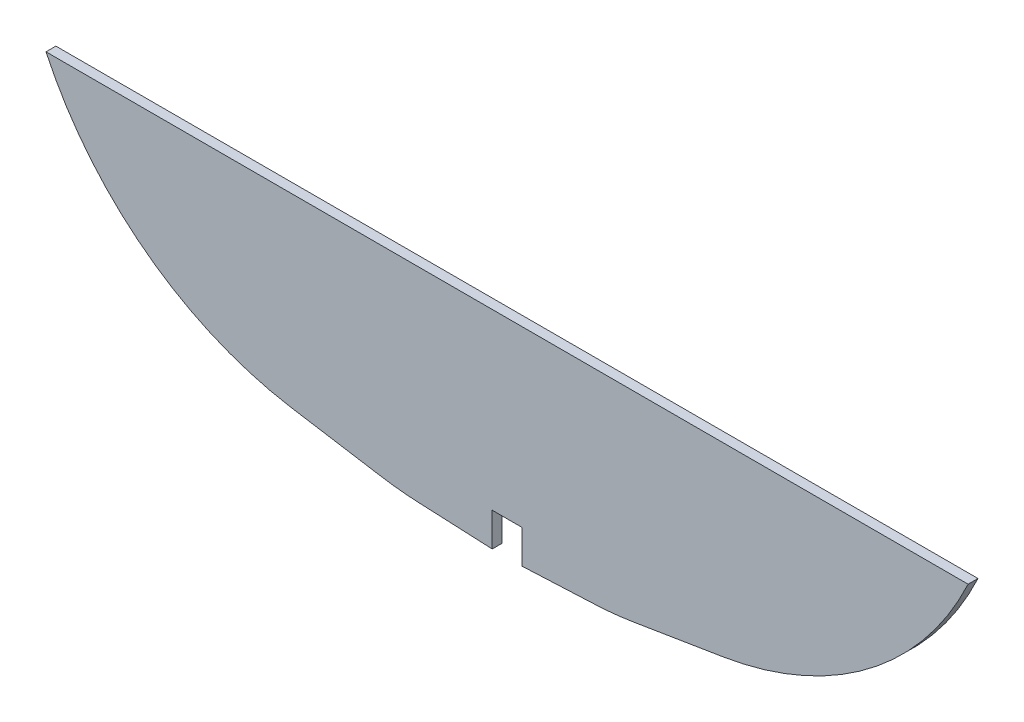
ISO-10303-21;
HEADER;
FILE_DESCRIPTION(('STEP AP214'),'2;1');
FILE_NAME('part.step','',(''),(''),'','','');
FILE_SCHEMA(('AUTOMOTIVE_DESIGN { 1 0 10303 214 1 1 1 1 }'));
ENDSEC;
DATA;
#1=APPLICATION_CONTEXT('core data for automotive mechanical design processes');
#2=APPLICATION_PROTOCOL_DEFINITION('international standard','automotive_design',2000,#1);
#3=PRODUCT_CONTEXT('',#1,'mechanical');
#4=PRODUCT('Part','Part','',(#3));
#5=PRODUCT_RELATED_PRODUCT_CATEGORY('part','',(#4));
#6=PRODUCT_DEFINITION_FORMATION('','',#4);
#7=PRODUCT_DEFINITION_CONTEXT('part definition',#1,'design');
#8=PRODUCT_DEFINITION('design','',#6,#7);
#9=PRODUCT_DEFINITION_SHAPE('','',#8);
#10=(LENGTH_UNIT() NAMED_UNIT(*) SI_UNIT(.MILLI.,.METRE.));
#11=(NAMED_UNIT(*) PLANE_ANGLE_UNIT() SI_UNIT($,.RADIAN.));
#12=(NAMED_UNIT(*) SI_UNIT($,.STERADIAN.) SOLID_ANGLE_UNIT());
#13=UNCERTAINTY_MEASURE_WITH_UNIT(LENGTH_MEASURE(1.E-05),#10,'distance_accuracy_value','');
#14=(GEOMETRIC_REPRESENTATION_CONTEXT(3) GLOBAL_UNCERTAINTY_ASSIGNED_CONTEXT((#13)) GLOBAL_UNIT_ASSIGNED_CONTEXT((#10,
#11,#12)) REPRESENTATION_CONTEXT('',''));
#15=CARTESIAN_POINT('',(0.,0.,0.));
#16=DIRECTION('',(0.,0.,1.));
#17=DIRECTION('',(1.,0.,0.));
#18=AXIS2_PLACEMENT_3D('',#15,#16,#17);
#19=CARTESIAN_POINT('',(3.43117854329258,-26.2574153577138,3.));
#20=DIRECTION('',(0.160874005706943,0.986974951195724,0.));
#21=DIRECTION('',(-0.986974951195724,0.160874005706943,0.));
#22=AXIS2_PLACEMENT_3D('',#19,#20,#21);
#23=PLANE('',#22);
#24=DIRECTION('',(0.986974951195724,-0.160874005706943,0.));
#25=VECTOR('',#24,1.);
#26=CARTESIAN_POINT('',(3.43117854329258,-26.2574153577138,0.));
#27=LINE('',#26,#25);
#28=CARTESIAN_POINT('',(-29.4279438011297,-20.9014753420553,0.));
#29=VERTEX_POINT('',#28);
#30=CARTESIAN_POINT('',(-2.25172300963461,-25.331119167775,0.));
#31=VERTEX_POINT('',#30);
#32=EDGE_CURVE('E162',#29,#31,#27,.T.);
#33=ORIENTED_EDGE('',*,*,#32,.T.);
#34=DIRECTION('',(0.,0.,-1.));
#35=VECTOR('',#34,1.);
#36=CARTESIAN_POINT('',(-2.25172300963461,-25.331119167775,3.));
#37=LINE('',#36,#35);
#38=CARTESIAN_POINT('',(-2.25172300963461,-25.331119167775,3.));
#39=VERTEX_POINT('',#38);
#40=EDGE_CURVE('E11',#31,#39,#37,.F.);
#41=ORIENTED_EDGE('',*,*,#40,.T.);
#42=DIRECTION('',(0.986974951195724,-0.160874005706943,0.));
#43=VECTOR('',#42,1.);
#44=CARTESIAN_POINT('',(3.43117854329258,-26.2574153577138,3.));
#45=LINE('',#44,#43);
#46=CARTESIAN_POINT('',(-29.4279438011297,-20.9014753420553,3.));
#47=VERTEX_POINT('',#46);
#48=EDGE_CURVE('E133',#47,#39,#45,.T.);
#49=ORIENTED_EDGE('',*,*,#48,.F.);
#50=DIRECTION('',(0.,0.,-1.));
#51=VECTOR('',#50,1.);
#52=CARTESIAN_POINT('',(-29.4279438011297,-20.9014753420553,3.));
#53=LINE('',#52,#51);
#54=EDGE_CURVE('E43',#47,#29,#53,.T.);
#55=ORIENTED_EDGE('',*,*,#54,.T.);
#56=EDGE_LOOP('',(#33,#41,#49,#55));
#57=FACE_BOUND('',#56,.T.);
#58=ADVANCED_FACE('F35',(#57),#23,.F.);
#59=CARTESIAN_POINT('',(31.5765866519712,-27.568395021453,3.));
#60=DIRECTION('',(0.0465283653815297,0.998916969129528,0.));
#61=DIRECTION('',(-0.998916969129528,0.0465283653815297,0.));
#62=AXIS2_PLACEMENT_3D('',#59,#60,#61);
#63=PLANE('',#62);
#64=DIRECTION('',(0.998916969129528,-0.0465283653815297,0.));
#65=VECTOR('',#64,1.);
#66=CARTESIAN_POINT('',(31.5765866519712,-27.568395021453,3.));
#67=LINE('',#66,#65);
#68=CARTESIAN_POINT('',(9.18284102290671,-26.5253209611554,3.));
#69=VERTEX_POINT('',#68);
#70=CARTESIAN_POINT('',(31.5765866519712,-27.568395021453,3.));
#71=VERTEX_POINT('',#70);
#72=EDGE_CURVE('E123',#69,#71,#67,.T.);
#73=ORIENTED_EDGE('',*,*,#72,.F.);
#74=DIRECTION('',(0.,0.,-1.));
#75=VECTOR('',#74,1.);
#76=CARTESIAN_POINT('',(9.18284102290671,-26.5253209611554,3.));
#77=LINE('',#76,#75);
#78=CARTESIAN_POINT('',(9.18284102290671,-26.5253209611554,0.));
#79=VERTEX_POINT('',#78);
#80=EDGE_CURVE('E212',#69,#79,#77,.T.);
#81=ORIENTED_EDGE('',*,*,#80,.T.);
#82=DIRECTION('',(0.998916969129528,-0.0465283653815297,0.));
#83=VECTOR('',#82,1.);
#84=CARTESIAN_POINT('',(31.5765866519712,-27.568395021453,0.));
#85=LINE('',#84,#83);
#86=CARTESIAN_POINT('',(31.5765866519712,-27.568395021453,0.));
#87=VERTEX_POINT('',#86);
#88=EDGE_CURVE('E139',#79,#87,#85,.T.);
#89=ORIENTED_EDGE('',*,*,#88,.T.);
#90=DIRECTION('',(0.,0.,-1.));
#91=VECTOR('',#90,1.);
#92=CARTESIAN_POINT('',(31.5765866519712,-27.568395021453,3.));
#93=LINE('',#92,#91);
#94=EDGE_CURVE('E136',#71,#87,#93,.T.);
#95=ORIENTED_EDGE('',*,*,#94,.F.);
#96=EDGE_LOOP('',(#73,#81,#89,#95));
#97=FACE_BOUND('',#96,.T.);
#98=ADVANCED_FACE('F137',(#97),#63,.F.);
#99=CARTESIAN_POINT('',(31.5765866519712,-27.568395021453,3.));
#100=DIRECTION('',(-1.,0.,0.));
#101=DIRECTION('',(0.,-1.,0.));
#102=AXIS2_PLACEMENT_3D('',#99,#100,#101);
#103=PLANE('',#102);
#104=DIRECTION('',(0.,1.,0.));
#105=VECTOR('',#104,1.);
#106=CARTESIAN_POINT('',(31.5765866519712,-27.568395021453,0.));
#107=LINE('',#106,#105);
#108=CARTESIAN_POINT('',(31.5765866519712,-17.368395021453,0.));
#109=VERTEX_POINT('',#108);
#110=EDGE_CURVE('E166',#87,#109,#107,.T.);
#111=ORIENTED_EDGE('',*,*,#110,.T.);
#112=DIRECTION('',(0.,0.,-1.));
#113=VECTOR('',#112,1.);
#114=CARTESIAN_POINT('',(31.5765866519712,-17.368395021453,3.));
#115=LINE('',#114,#113);
#116=CARTESIAN_POINT('',(31.5765866519712,-17.368395021453,3.));
#117=VERTEX_POINT('',#116);
#118=EDGE_CURVE('E143',#117,#109,#115,.T.);
#119=ORIENTED_EDGE('',*,*,#118,.F.);
#120=DIRECTION('',(0.,1.,0.));
#121=VECTOR('',#120,1.);
#122=CARTESIAN_POINT('',(31.5765866519712,-27.568395021453,3.));
#123=LINE('',#122,#121);
#124=EDGE_CURVE('E128',#71,#117,#123,.T.);
#125=ORIENTED_EDGE('',*,*,#124,.F.);
#126=ORIENTED_EDGE('',*,*,#94,.T.);
#127=EDGE_LOOP('',(#111,#119,#125,#126));
#128=FACE_BOUND('',#127,.T.);
#129=ADVANCED_FACE('F145',(#128),#103,.F.);
#130=CARTESIAN_POINT('',(31.5765866519712,-17.368395021453,3.));
#131=DIRECTION('',(0.,1.,0.));
#132=DIRECTION('',(0.,0.,1.));
#133=AXIS2_PLACEMENT_3D('',#130,#131,#132);
#134=PLANE('',#133);
#135=DIRECTION('',(1.,0.,0.));
#136=VECTOR('',#135,1.);
#137=CARTESIAN_POINT('',(31.5765866519712,-17.368395021453,0.));
#138=LINE('',#137,#136);
#139=CARTESIAN_POINT('',(40.5765866519712,-17.368395021453,0.));
#140=VERTEX_POINT('',#139);
#141=EDGE_CURVE('E168',#109,#140,#138,.T.);
#142=ORIENTED_EDGE('',*,*,#141,.T.);
#143=DIRECTION('',(0.,0.,-1.));
#144=VECTOR('',#143,1.);
#145=CARTESIAN_POINT('',(40.5765866519712,-17.368395021453,3.));
#146=LINE('',#145,#144);
#147=CARTESIAN_POINT('',(40.5765866519712,-17.368395021453,3.));
#148=VERTEX_POINT('',#147);
#149=EDGE_CURVE('E188',#148,#140,#146,.T.);
#150=ORIENTED_EDGE('',*,*,#149,.F.);
#151=DIRECTION('',(1.,0.,0.));
#152=VECTOR('',#151,1.);
#153=CARTESIAN_POINT('',(31.5765866519712,-17.368395021453,3.));
#154=LINE('',#153,#152);
#155=EDGE_CURVE('E148',#117,#148,#154,.T.);
#156=ORIENTED_EDGE('',*,*,#155,.F.);
#157=ORIENTED_EDGE('',*,*,#118,.T.);
#158=EDGE_LOOP('',(#142,#150,#156,#157));
#159=FACE_BOUND('',#158,.T.);
#160=ADVANCED_FACE('F253',(#159),#134,.F.);
#161=CARTESIAN_POINT('',(40.5765866519712,-27.568395021453,3.));
#162=DIRECTION('',(1.,0.,0.));
#163=DIRECTION('',(0.,1.,0.));
#164=AXIS2_PLACEMENT_3D('',#161,#162,#163);
#165=PLANE('',#164);
#166=DIRECTION('',(0.,-1.,0.));
#167=VECTOR('',#166,1.);
#168=CARTESIAN_POINT('',(40.5765866519712,-27.568395021453,0.));
#169=LINE('',#168,#167);
#170=CARTESIAN_POINT('',(40.5765866519712,-27.568395021453,0.));
#171=VERTEX_POINT('',#170);
#172=EDGE_CURVE('E170',#140,#171,#169,.T.);
#173=ORIENTED_EDGE('',*,*,#172,.T.);
#174=DIRECTION('',(0.,0.,-1.));
#175=VECTOR('',#174,1.);
#176=CARTESIAN_POINT('',(40.5765866519712,-27.568395021453,3.));
#177=LINE('',#176,#175);
#178=CARTESIAN_POINT('',(40.5765866519712,-27.568395021453,3.));
#179=VERTEX_POINT('',#178);
#180=EDGE_CURVE('E185',#179,#171,#177,.T.);
#181=ORIENTED_EDGE('',*,*,#180,.F.);
#182=DIRECTION('',(0.,-1.,0.));
#183=VECTOR('',#182,1.);
#184=CARTESIAN_POINT('',(40.5765866519712,-27.568395021453,3.));
#185=LINE('',#184,#183);
#186=EDGE_CURVE('E150',#148,#179,#185,.T.);
#187=ORIENTED_EDGE('',*,*,#186,.F.);
#188=ORIENTED_EDGE('',*,*,#149,.T.);
#189=EDGE_LOOP('',(#173,#181,#187,#188));
#190=FACE_BOUND('',#189,.T.);
#191=ADVANCED_FACE('F249',(#190),#165,.F.);
#192=CARTESIAN_POINT('',(40.5765866519712,-27.568395021453,3.));
#193=DIRECTION('',(-0.0465283653815297,0.998916969129528,0.));
#194=DIRECTION('',(-0.998916969129528,-0.0465283653815297,0.));
#195=AXIS2_PLACEMENT_3D('',#192,#193,#194);
#196=PLANE('',#195);
#197=DIRECTION('',(0.998916969129528,0.0465283653815297,0.));
#198=VECTOR('',#197,1.);
#199=CARTESIAN_POINT('',(40.5765866519712,-27.568395021453,0.));
#200=LINE('',#199,#198);
#201=CARTESIAN_POINT('',(62.9703322810358,-26.5253209611554,0.));
#202=VERTEX_POINT('',#201);
#203=EDGE_CURVE('E172',#171,#202,#200,.T.);
#204=ORIENTED_EDGE('',*,*,#203,.T.);
#205=DIRECTION('',(0.,0.,-1.));
#206=VECTOR('',#205,1.);
#207=CARTESIAN_POINT('',(62.9703322810358,-26.5253209611554,3.));
#208=LINE('',#207,#206);
#209=CARTESIAN_POINT('',(62.9703322810358,-26.5253209611554,3.));
#210=VERTEX_POINT('',#209);
#211=EDGE_CURVE('E50',#202,#210,#208,.F.);
#212=ORIENTED_EDGE('',*,*,#211,.T.);
#213=DIRECTION('',(0.998916969129528,0.0465283653815297,0.));
#214=VECTOR('',#213,1.);
#215=CARTESIAN_POINT('',(40.5765866519712,-27.568395021453,3.));
#216=LINE('',#215,#214);
#217=EDGE_CURVE('E155',#179,#210,#216,.T.);
#218=ORIENTED_EDGE('',*,*,#217,.F.);
#219=ORIENTED_EDGE('',*,*,#180,.T.);
#220=EDGE_LOOP('',(#204,#212,#218,#219));
#221=FACE_BOUND('',#220,.T.);
#222=ADVANCED_FACE('F245',(#221),#196,.F.);
#223=CARTESIAN_POINT('',(68.7219947606498,-26.2574153577138,3.));
#224=DIRECTION('',(-0.160874005706943,0.986974951195724,0.));
#225=DIRECTION('',(-0.986974951195724,-0.160874005706943,0.));
#226=AXIS2_PLACEMENT_3D('',#223,#224,#225);
#227=PLANE('',#226);
#228=DIRECTION('',(0.986974951195724,0.160874005706943,0.));
#229=VECTOR('',#228,1.);
#230=CARTESIAN_POINT('',(68.7219947606498,-26.2574153577138,0.));
#231=LINE('',#230,#229);
#232=CARTESIAN_POINT('',(74.4048963135771,-25.331119167775,0.));
#233=VERTEX_POINT('',#232);
#234=CARTESIAN_POINT('',(101.581117105072,-20.9014753420553,0.));
#235=VERTEX_POINT('',#234);
#236=EDGE_CURVE('E174',#233,#235,#231,.T.);
#237=ORIENTED_EDGE('',*,*,#236,.T.);
#238=DIRECTION('',(0.,0.,1.));
#239=VECTOR('',#238,1.);
#240=CARTESIAN_POINT('',(101.581117105072,-20.9014753420553,3.));
#241=LINE('',#240,#239);
#242=CARTESIAN_POINT('',(101.581117105072,-20.9014753420553,3.));
#243=VERTEX_POINT('',#242);
#244=EDGE_CURVE('E202',#235,#243,#241,.T.);
#245=ORIENTED_EDGE('',*,*,#244,.T.);
#246=DIRECTION('',(0.986974951195724,0.160874005706943,0.));
#247=VECTOR('',#246,1.);
#248=CARTESIAN_POINT('',(68.7219947606498,-26.2574153577138,3.));
#249=LINE('',#248,#247);
#250=CARTESIAN_POINT('',(74.4048963135771,-25.331119167775,3.));
#251=VERTEX_POINT('',#250);
#252=EDGE_CURVE('E157',#251,#243,#249,.T.);
#253=ORIENTED_EDGE('',*,*,#252,.F.);
#254=DIRECTION('',(0.,0.,-1.));
#255=VECTOR('',#254,1.);
#256=CARTESIAN_POINT('',(74.4048963135771,-25.331119167775,3.));
#257=LINE('',#256,#255);
#258=EDGE_CURVE('E199',#251,#233,#257,.T.);
#259=ORIENTED_EDGE('',*,*,#258,.T.);
#260=EDGE_LOOP('',(#237,#245,#253,#259));
#261=FACE_BOUND('',#260,.T.);
#262=ADVANCED_FACE('F235',(#261),#227,.F.);
#263=CARTESIAN_POINT('',(-103.923413348029,35.431604978547,3.));
#264=DIRECTION('',(0.,-1.,0.));
#265=DIRECTION('',(1.,0.,0.));
#266=AXIS2_PLACEMENT_3D('',#263,#264,#265);
#267=PLANE('',#266);
#268=DIRECTION('',(-1.,0.,0.));
#269=VECTOR('',#268,1.);
#270=CARTESIAN_POINT('',(-103.923413348029,35.431604978547,0.));
#271=LINE('',#270,#269);
#272=CARTESIAN_POINT('',(176.076586651971,35.431604978547,0.));
#273=VERTEX_POINT('',#272);
#274=CARTESIAN_POINT('',(-103.923413348029,35.431604978547,0.));
#275=VERTEX_POINT('',#274);
#276=EDGE_CURVE('E177',#273,#275,#271,.T.);
#277=ORIENTED_EDGE('',*,*,#276,.T.);
#278=DIRECTION('',(0.,0.,-1.));
#279=VECTOR('',#278,1.);
#280=CARTESIAN_POINT('',(-103.923413348029,35.431604978547,3.));
#281=LINE('',#280,#279);
#282=CARTESIAN_POINT('',(-103.923413348029,35.431604978547,3.));
#283=VERTEX_POINT('',#282);
#284=EDGE_CURVE('E161',#283,#275,#281,.T.);
#285=ORIENTED_EDGE('',*,*,#284,.F.);
#286=DIRECTION('',(-1.,0.,0.));
#287=VECTOR('',#286,1.);
#288=CARTESIAN_POINT('',(-103.923413348029,35.431604978547,3.));
#289=LINE('',#288,#287);
#290=CARTESIAN_POINT('',(176.076586651971,35.431604978547,3.));
#291=VERTEX_POINT('',#290);
#292=EDGE_CURVE('E159',#291,#283,#289,.T.);
#293=ORIENTED_EDGE('',*,*,#292,.F.);
#294=DIRECTION('',(0.,0.,-1.));
#295=VECTOR('',#294,1.);
#296=CARTESIAN_POINT('',(176.076586651971,35.431604978547,3.));
#297=LINE('',#296,#295);
#298=EDGE_CURVE('E182',#291,#273,#297,.T.);
#299=ORIENTED_EDGE('',*,*,#298,.T.);
#300=EDGE_LOOP('',(#277,#285,#293,#299));
#301=FACE_BOUND('',#300,.T.);
#302=ADVANCED_FACE('F229',(#301),#267,.F.);
#303=CARTESIAN_POINT('',(0.,0.,3.));
#304=DIRECTION('',(0.,0.,1.));
#305=DIRECTION('',(1.,0.,0.));
#306=AXIS2_PLACEMENT_3D('',#303,#304,#305);
#307=PLANE('',#306);
#308=ORIENTED_EDGE('',*,*,#252,.T.);
#309=CARTESIAN_POINT('',(85.4937165343777,77.7960197775171,3.));
#310=DIRECTION('',(0.,0.,1.));
#311=DIRECTION('',(1.,0.,0.));
#312=AXIS2_PLACEMENT_3D('',#309,#310,#311);
#313=CIRCLE('',#312,100.);
#314=EDGE_CURVE('E209',#243,#291,#313,.T.);
#315=ORIENTED_EDGE('',*,*,#314,.T.);
#316=ORIENTED_EDGE('',*,*,#292,.T.);
#317=CARTESIAN_POINT('',(-13.3405432304354,77.7960197775171,3.));
#318=DIRECTION('',(0.,0.,1.));
#319=DIRECTION('',(1.,0.,0.));
#320=AXIS2_PLACEMENT_3D('',#317,#318,#319);
#321=CIRCLE('',#320,100.);
#322=EDGE_CURVE('E204',#283,#47,#321,.T.);
#323=ORIENTED_EDGE('',*,*,#322,.T.);
#324=ORIENTED_EDGE('',*,*,#48,.T.);
#325=CARTESIAN_POINT('',(13.8356775610597,73.3663759517974,3.));
#326=DIRECTION('',(0.,0.,1.));
#327=DIRECTION('',(1.,0.,0.));
#328=AXIS2_PLACEMENT_3D('',#325,#326,#327);
#329=CIRCLE('',#328,100.);
#330=EDGE_CURVE('E58',#39,#69,#329,.T.);
#331=ORIENTED_EDGE('',*,*,#330,.T.);
#332=ORIENTED_EDGE('',*,*,#72,.T.);
#333=ORIENTED_EDGE('',*,*,#124,.T.);
#334=ORIENTED_EDGE('',*,*,#155,.T.);
#335=ORIENTED_EDGE('',*,*,#186,.T.);
#336=ORIENTED_EDGE('',*,*,#217,.T.);
#337=CARTESIAN_POINT('',(58.3174957428828,73.3663759517974,3.));
#338=DIRECTION('',(0.,0.,1.));
#339=DIRECTION('',(1.,0.,0.));
#340=AXIS2_PLACEMENT_3D('',#337,#338,#339);
#341=CIRCLE('',#340,100.);
#342=EDGE_CURVE('E207',#210,#251,#341,.T.);
#343=ORIENTED_EDGE('',*,*,#342,.T.);
#344=EDGE_LOOP('',(#308,#315,#316,#323,#324,#331,#332,#333,#334,#335,#336,#343));
#345=FACE_BOUND('',#344,.T.);
#346=ADVANCED_FACE('F126',(#345),#307,.T.);
#347=CARTESIAN_POINT('',(0.,0.,0.));
#348=DIRECTION('',(0.,0.,1.));
#349=DIRECTION('',(1.,0.,0.));
#350=AXIS2_PLACEMENT_3D('',#347,#348,#349);
#351=PLANE('',#350);
#352=ORIENTED_EDGE('',*,*,#276,.F.);
#353=CARTESIAN_POINT('',(85.4937165343777,77.7960197775171,0.));
#354=DIRECTION('',(0.,0.,1.));
#355=DIRECTION('',(1.,0.,0.));
#356=AXIS2_PLACEMENT_3D('',#353,#354,#355);
#357=CIRCLE('',#356,100.);
#358=EDGE_CURVE('E197',#273,#235,#357,.F.);
#359=ORIENTED_EDGE('',*,*,#358,.T.);
#360=ORIENTED_EDGE('',*,*,#236,.F.);
#361=CARTESIAN_POINT('',(58.3174957428828,73.3663759517974,0.));
#362=DIRECTION('',(0.,0.,1.));
#363=DIRECTION('',(1.,0.,0.));
#364=AXIS2_PLACEMENT_3D('',#361,#362,#363);
#365=CIRCLE('',#364,100.);
#366=EDGE_CURVE('E195',#233,#202,#365,.F.);
#367=ORIENTED_EDGE('',*,*,#366,.T.);
#368=ORIENTED_EDGE('',*,*,#203,.F.);
#369=ORIENTED_EDGE('',*,*,#172,.F.);
#370=ORIENTED_EDGE('',*,*,#141,.F.);
#371=ORIENTED_EDGE('',*,*,#110,.F.);
#372=ORIENTED_EDGE('',*,*,#88,.F.);
#373=CARTESIAN_POINT('',(13.8356775610597,73.3663759517974,0.));
#374=DIRECTION('',(0.,0.,1.));
#375=DIRECTION('',(1.,0.,0.));
#376=AXIS2_PLACEMENT_3D('',#373,#374,#375);
#377=CIRCLE('',#376,100.);
#378=EDGE_CURVE('E193',#79,#31,#377,.F.);
#379=ORIENTED_EDGE('',*,*,#378,.T.);
#380=ORIENTED_EDGE('',*,*,#32,.F.);
#381=CARTESIAN_POINT('',(-13.3405432304354,77.7960197775171,0.));
#382=DIRECTION('',(0.,0.,1.));
#383=DIRECTION('',(1.,0.,0.));
#384=AXIS2_PLACEMENT_3D('',#381,#382,#383);
#385=CIRCLE('',#384,100.);
#386=EDGE_CURVE('E142',#29,#275,#385,.F.);
#387=ORIENTED_EDGE('',*,*,#386,.T.);
#388=EDGE_LOOP('',(#352,#359,#360,#367,#368,#369,#370,#371,#372,#379,#380,#387));
#389=FACE_BOUND('',#388,.T.);
#390=ADVANCED_FACE('F223',(#389),#351,.F.);
#391=CARTESIAN_POINT('',(85.4937165343777,77.7960197775171,3.));
#392=DIRECTION('',(0.,0.,1.));
#393=DIRECTION('',(1.,0.,0.));
#394=AXIS2_PLACEMENT_3D('',#391,#392,#393);
#395=CYLINDRICAL_SURFACE('',#394,100.);
#396=ORIENTED_EDGE('',*,*,#314,.F.);
#397=ORIENTED_EDGE('',*,*,#244,.F.);
#398=ORIENTED_EDGE('',*,*,#358,.F.);
#399=ORIENTED_EDGE('',*,*,#298,.F.);
#400=EDGE_LOOP('',(#396,#397,#398,#399));
#401=FACE_BOUND('',#400,.T.);
#402=ADVANCED_FACE('F239',(#401),#395,.T.);
#403=CARTESIAN_POINT('',(58.3174957428828,73.3663759517974,3.));
#404=DIRECTION('',(0.,0.,-1.));
#405=DIRECTION('',(-1.,0.,0.));
#406=AXIS2_PLACEMENT_3D('',#403,#404,#405);
#407=CYLINDRICAL_SURFACE('',#406,100.);
#408=ORIENTED_EDGE('',*,*,#342,.F.);
#409=ORIENTED_EDGE('',*,*,#211,.F.);
#410=ORIENTED_EDGE('',*,*,#366,.F.);
#411=ORIENTED_EDGE('',*,*,#258,.F.);
#412=EDGE_LOOP('',(#408,#409,#410,#411));
#413=FACE_BOUND('',#412,.T.);
#414=ADVANCED_FACE('F242',(#413),#407,.T.);
#415=CARTESIAN_POINT('',(13.8356775610597,73.3663759517974,3.));
#416=DIRECTION('',(0.,0.,-1.));
#417=DIRECTION('',(-1.,0.,0.));
#418=AXIS2_PLACEMENT_3D('',#415,#416,#417);
#419=CYLINDRICAL_SURFACE('',#418,100.);
#420=ORIENTED_EDGE('',*,*,#330,.F.);
#421=ORIENTED_EDGE('',*,*,#40,.F.);
#422=ORIENTED_EDGE('',*,*,#378,.F.);
#423=ORIENTED_EDGE('',*,*,#80,.F.);
#424=EDGE_LOOP('',(#420,#421,#422,#423));
#425=FACE_BOUND('',#424,.T.);
#426=ADVANCED_FACE('F225',(#425),#419,.T.);
#427=CARTESIAN_POINT('',(-13.3405432304354,77.7960197775171,3.));
#428=DIRECTION('',(0.,0.,-1.));
#429=DIRECTION('',(-1.,0.,0.));
#430=AXIS2_PLACEMENT_3D('',#427,#428,#429);
#431=CYLINDRICAL_SURFACE('',#430,100.);
#432=ORIENTED_EDGE('',*,*,#322,.F.);
#433=ORIENTED_EDGE('',*,*,#284,.T.);
#434=ORIENTED_EDGE('',*,*,#386,.F.);
#435=ORIENTED_EDGE('',*,*,#54,.F.);
#436=EDGE_LOOP('',(#432,#433,#434,#435));
#437=FACE_BOUND('',#436,.T.);
#438=ADVANCED_FACE('F37',(#437),#431,.T.);
#439=CLOSED_SHELL('',(#58,#98,#129,#160,#191,#222,#262,#302,#346,#390,#402,#414,#426,#438));
#440=MANIFOLD_SOLID_BREP('B2',#439);
#441=ADVANCED_BREP_SHAPE_REPRESENTATION('',(#18,#440),#14);
#442=SHAPE_DEFINITION_REPRESENTATION(#9,#441);
ENDSEC;
END-ISO-10303-21;
